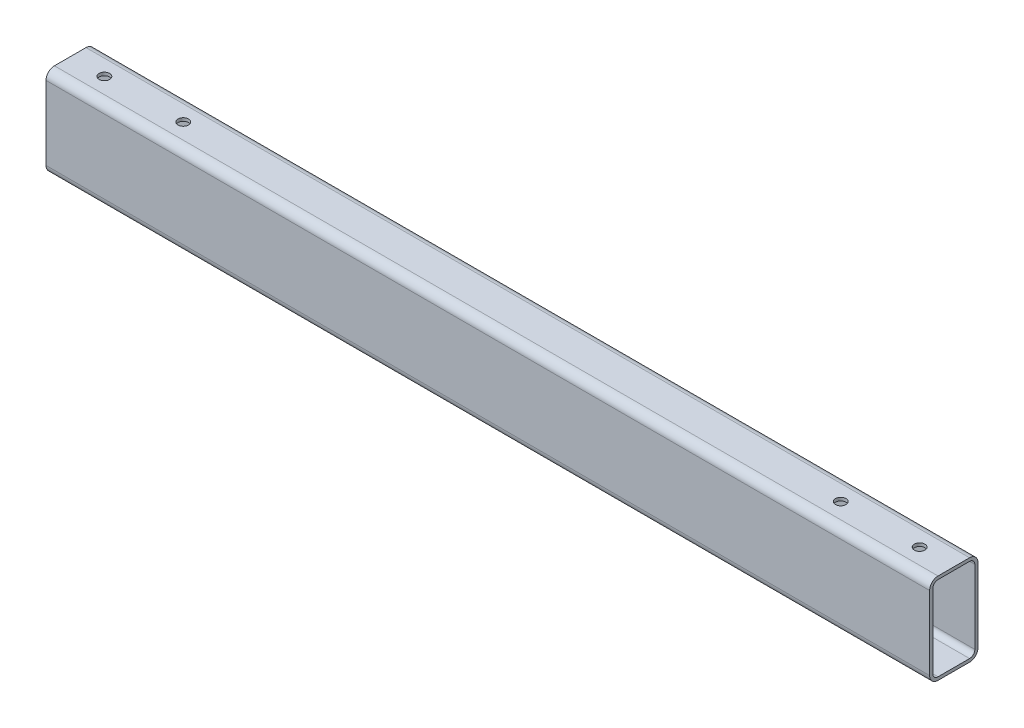
ISO-10303-21;
HEADER;
FILE_DESCRIPTION(('STEP AP214'),'2;1');
FILE_NAME('part.step','',(''),(''),'','','');
FILE_SCHEMA(('AUTOMOTIVE_DESIGN { 1 0 10303 214 1 1 1 1 }'));
ENDSEC;
DATA;
#1=APPLICATION_CONTEXT('core data for automotive mechanical design processes');
#2=APPLICATION_PROTOCOL_DEFINITION('international standard','automotive_design',2000,#1);
#3=PRODUCT_CONTEXT('',#1,'mechanical');
#4=PRODUCT('Part','Part','',(#3));
#5=PRODUCT_RELATED_PRODUCT_CATEGORY('part','',(#4));
#6=PRODUCT_DEFINITION_FORMATION('','',#4);
#7=PRODUCT_DEFINITION_CONTEXT('part definition',#1,'design');
#8=PRODUCT_DEFINITION('design','',#6,#7);
#9=PRODUCT_DEFINITION_SHAPE('','',#8);
#10=(LENGTH_UNIT() NAMED_UNIT(*) SI_UNIT(.MILLI.,.METRE.));
#11=(NAMED_UNIT(*) PLANE_ANGLE_UNIT() SI_UNIT($,.RADIAN.));
#12=(NAMED_UNIT(*) SI_UNIT($,.STERADIAN.) SOLID_ANGLE_UNIT());
#13=UNCERTAINTY_MEASURE_WITH_UNIT(LENGTH_MEASURE(1.E-05),#10,'distance_accuracy_value','');
#14=(GEOMETRIC_REPRESENTATION_CONTEXT(3) GLOBAL_UNCERTAINTY_ASSIGNED_CONTEXT((#13)) GLOBAL_UNIT_ASSIGNED_CONTEXT((#10,
#11,#12)) REPRESENTATION_CONTEXT('',''));
#15=CARTESIAN_POINT('',(0.,0.,0.));
#16=DIRECTION('',(0.,0.,1.));
#17=DIRECTION('',(1.,0.,0.));
#18=AXIS2_PLACEMENT_3D('',#15,#16,#17);
#19=CARTESIAN_POINT('',(-420.,-35.,15.));
#20=DIRECTION('',(1.,0.,0.));
#21=DIRECTION('',(0.,0.,-1.));
#22=AXIS2_PLACEMENT_3D('',#19,#20,#21);
#23=CYLINDRICAL_SURFACE('',#22,8.);
#24=DIRECTION('',(1.,0.,0.));
#25=VECTOR('',#24,1.);
#26=CARTESIAN_POINT('',(-420.,-43.,15.));
#27=LINE('',#26,#25);
#28=CARTESIAN_POINT('',(-420.,-43.,15.));
#29=VERTEX_POINT('',#28);
#30=CARTESIAN_POINT('',(420.,-43.,15.));
#31=VERTEX_POINT('',#30);
#32=EDGE_CURVE('E363',#29,#31,#27,.T.);
#33=ORIENTED_EDGE('',*,*,#32,.T.);
#34=CARTESIAN_POINT('',(420.,-35.,15.));
#35=DIRECTION('',(1.,0.,0.));
#36=DIRECTION('',(0.,0.,-1.));
#37=AXIS2_PLACEMENT_3D('',#34,#35,#36);
#38=CIRCLE('',#37,8.);
#39=CARTESIAN_POINT('',(420.,-35.,23.));
#40=VERTEX_POINT('',#39);
#41=EDGE_CURVE('E287',#40,#31,#38,.T.);
#42=ORIENTED_EDGE('',*,*,#41,.F.);
#43=DIRECTION('',(1.,0.,0.));
#44=VECTOR('',#43,1.);
#45=CARTESIAN_POINT('',(-420.,-35.,23.));
#46=LINE('',#45,#44);
#47=CARTESIAN_POINT('',(-420.,-35.,23.));
#48=VERTEX_POINT('',#47);
#49=EDGE_CURVE('E12',#48,#40,#46,.T.);
#50=ORIENTED_EDGE('',*,*,#49,.F.);
#51=CARTESIAN_POINT('',(-420.,-35.,15.));
#52=DIRECTION('',(1.,0.,0.));
#53=DIRECTION('',(0.,0.,-1.));
#54=AXIS2_PLACEMENT_3D('',#51,#52,#53);
#55=CIRCLE('',#54,8.);
#56=EDGE_CURVE('E330',#48,#29,#55,.T.);
#57=ORIENTED_EDGE('',*,*,#56,.T.);
#58=EDGE_LOOP('',(#33,#42,#50,#57));
#59=FACE_BOUND('',#58,.T.);
#60=ADVANCED_FACE('F129',(#59),#23,.T.);
#61=CARTESIAN_POINT('',(-420.,-35.,23.));
#62=DIRECTION('',(0.,0.,1.));
#63=DIRECTION('',(1.,0.,0.));
#64=AXIS2_PLACEMENT_3D('',#61,#62,#63);
#65=PLANE('',#64);
#66=ORIENTED_EDGE('',*,*,#49,.T.);
#67=DIRECTION('',(0.,-1.,0.));
#68=VECTOR('',#67,1.);
#69=CARTESIAN_POINT('',(420.,-35.,23.));
#70=LINE('',#69,#68);
#71=CARTESIAN_POINT('',(420.,35.,23.));
#72=VERTEX_POINT('',#71);
#73=EDGE_CURVE('E308',#72,#40,#70,.T.);
#74=ORIENTED_EDGE('',*,*,#73,.F.);
#75=DIRECTION('',(1.,0.,0.));
#76=VECTOR('',#75,1.);
#77=CARTESIAN_POINT('',(-420.,35.,23.));
#78=LINE('',#77,#76);
#79=CARTESIAN_POINT('',(-420.,35.,23.));
#80=VERTEX_POINT('',#79);
#81=EDGE_CURVE('E137',#80,#72,#78,.T.);
#82=ORIENTED_EDGE('',*,*,#81,.F.);
#83=DIRECTION('',(0.,-1.,0.));
#84=VECTOR('',#83,1.);
#85=CARTESIAN_POINT('',(-420.,-35.,23.));
#86=LINE('',#85,#84);
#87=EDGE_CURVE('E361',#80,#48,#86,.T.);
#88=ORIENTED_EDGE('',*,*,#87,.T.);
#89=EDGE_LOOP('',(#66,#74,#82,#88));
#90=FACE_BOUND('',#89,.T.);
#91=ADVANCED_FACE('F428',(#90),#65,.T.);
#92=CARTESIAN_POINT('',(-420.,35.,15.));
#93=DIRECTION('',(1.,0.,0.));
#94=DIRECTION('',(0.,0.,-1.));
#95=AXIS2_PLACEMENT_3D('',#92,#93,#94);
#96=CYLINDRICAL_SURFACE('',#95,8.);
#97=ORIENTED_EDGE('',*,*,#81,.T.);
#98=CARTESIAN_POINT('',(420.,35.,15.));
#99=DIRECTION('',(1.,0.,0.));
#100=DIRECTION('',(0.,0.,-1.));
#101=AXIS2_PLACEMENT_3D('',#98,#99,#100);
#102=CIRCLE('',#101,8.);
#103=CARTESIAN_POINT('',(420.,43.,15.));
#104=VERTEX_POINT('',#103);
#105=EDGE_CURVE('E305',#104,#72,#102,.T.);
#106=ORIENTED_EDGE('',*,*,#105,.F.);
#107=DIRECTION('',(1.,0.,0.));
#108=VECTOR('',#107,1.);
#109=CARTESIAN_POINT('',(-420.,43.,15.));
#110=LINE('',#109,#108);
#111=CARTESIAN_POINT('',(-420.,43.,15.));
#112=VERTEX_POINT('',#111);
#113=EDGE_CURVE('E366',#112,#104,#110,.T.);
#114=ORIENTED_EDGE('',*,*,#113,.F.);
#115=CARTESIAN_POINT('',(-420.,35.,15.));
#116=DIRECTION('',(1.,0.,0.));
#117=DIRECTION('',(0.,0.,-1.));
#118=AXIS2_PLACEMENT_3D('',#115,#116,#117);
#119=CIRCLE('',#118,8.);
#120=EDGE_CURVE('E358',#112,#80,#119,.T.);
#121=ORIENTED_EDGE('',*,*,#120,.T.);
#122=EDGE_LOOP('',(#97,#106,#114,#121));
#123=FACE_BOUND('',#122,.T.);
#124=ADVANCED_FACE('F432',(#123),#96,.T.);
#125=CARTESIAN_POINT('',(-420.,43.,15.));
#126=DIRECTION('',(0.,1.,0.));
#127=DIRECTION('',(0.,0.,1.));
#128=AXIS2_PLACEMENT_3D('',#125,#126,#127);
#129=PLANE('',#128);
#130=CARTESIAN_POINT('',(-387.5,43.,0.));
#131=DIRECTION('',(0.,1.,0.));
#132=DIRECTION('',(0.,0.,1.));
#133=AXIS2_PLACEMENT_3D('',#130,#131,#132);
#134=CIRCLE('',#133,4.99999999999999);
#135=CARTESIAN_POINT('',(-387.5,43.,4.99999999999999));
#136=VERTEX_POINT('',#135);
#137=EDGE_CURVE('E497',#136,#136,#134,.T.);
#138=ORIENTED_EDGE('',*,*,#137,.F.);
#139=EDGE_LOOP('',(#138));
#140=FACE_BOUND('',#139,.T.);
#141=CARTESIAN_POINT('',(312.5,43.,0.));
#142=DIRECTION('',(0.,1.,0.));
#143=DIRECTION('',(0.,0.,-1.));
#144=AXIS2_PLACEMENT_3D('',#141,#142,#143);
#145=CIRCLE('',#144,4.99999999999999);
#146=CARTESIAN_POINT('',(312.5,43.,-4.99999999999999));
#147=VERTEX_POINT('',#146);
#148=EDGE_CURVE('E510',#147,#147,#145,.T.);
#149=ORIENTED_EDGE('',*,*,#148,.F.);
#150=EDGE_LOOP('',(#149));
#151=FACE_BOUND('',#150,.T.);
#152=CARTESIAN_POINT('',(387.5,43.,0.));
#153=DIRECTION('',(0.,1.,0.));
#154=DIRECTION('',(0.,0.,-1.));
#155=AXIS2_PLACEMENT_3D('',#152,#153,#154);
#156=CIRCLE('',#155,4.99999999999999);
#157=CARTESIAN_POINT('',(387.5,43.,-4.99999999999999));
#158=VERTEX_POINT('',#157);
#159=EDGE_CURVE('E506',#158,#158,#156,.T.);
#160=ORIENTED_EDGE('',*,*,#159,.F.);
#161=EDGE_LOOP('',(#160));
#162=FACE_BOUND('',#161,.T.);
#163=CARTESIAN_POINT('',(-312.5,43.,0.));
#164=DIRECTION('',(0.,1.,0.));
#165=DIRECTION('',(0.,0.,1.));
#166=AXIS2_PLACEMENT_3D('',#163,#164,#165);
#167=CIRCLE('',#166,4.99999999999999);
#168=CARTESIAN_POINT('',(-312.5,43.,4.99999999999999));
#169=VERTEX_POINT('',#168);
#170=EDGE_CURVE('E498',#169,#169,#167,.T.);
#171=ORIENTED_EDGE('',*,*,#170,.F.);
#172=EDGE_LOOP('',(#171));
#173=FACE_BOUND('',#172,.T.);
#174=ORIENTED_EDGE('',*,*,#113,.T.);
#175=DIRECTION('',(0.,0.,1.));
#176=VECTOR('',#175,1.);
#177=CARTESIAN_POINT('',(420.,43.,15.));
#178=LINE('',#177,#176);
#179=CARTESIAN_POINT('',(420.,43.,-14.9999999999999));
#180=VERTEX_POINT('',#179);
#181=EDGE_CURVE('E302',#180,#104,#178,.T.);
#182=ORIENTED_EDGE('',*,*,#181,.F.);
#183=DIRECTION('',(1.,0.,0.));
#184=VECTOR('',#183,1.);
#185=CARTESIAN_POINT('',(-420.,43.,-14.9999999999999));
#186=LINE('',#185,#184);
#187=CARTESIAN_POINT('',(-420.,43.,-14.9999999999999));
#188=VERTEX_POINT('',#187);
#189=EDGE_CURVE('E368',#188,#180,#186,.T.);
#190=ORIENTED_EDGE('',*,*,#189,.F.);
#191=DIRECTION('',(0.,0.,1.));
#192=VECTOR('',#191,1.);
#193=CARTESIAN_POINT('',(-420.,43.,15.));
#194=LINE('',#193,#192);
#195=EDGE_CURVE('E355',#188,#112,#194,.T.);
#196=ORIENTED_EDGE('',*,*,#195,.T.);
#197=EDGE_LOOP('',(#174,#182,#190,#196));
#198=FACE_BOUND('',#197,.T.);
#199=ADVANCED_FACE('F460',(#140,#151,#162,#173,#198),#129,.T.);
#200=CARTESIAN_POINT('',(-420.,35.,-15.));
#201=DIRECTION('',(1.,0.,0.));
#202=DIRECTION('',(0.,0.,-1.));
#203=AXIS2_PLACEMENT_3D('',#200,#201,#202);
#204=CYLINDRICAL_SURFACE('',#203,8.);
#205=ORIENTED_EDGE('',*,*,#189,.T.);
#206=CARTESIAN_POINT('',(420.,35.,-15.));
#207=DIRECTION('',(1.,0.,0.));
#208=DIRECTION('',(0.,0.,-1.));
#209=AXIS2_PLACEMENT_3D('',#206,#207,#208);
#210=CIRCLE('',#209,8.);
#211=CARTESIAN_POINT('',(420.,35.,-23.));
#212=VERTEX_POINT('',#211);
#213=EDGE_CURVE('E299',#212,#180,#210,.T.);
#214=ORIENTED_EDGE('',*,*,#213,.F.);
#215=DIRECTION('',(1.,0.,0.));
#216=VECTOR('',#215,1.);
#217=CARTESIAN_POINT('',(-420.,35.,-23.));
#218=LINE('',#217,#216);
#219=CARTESIAN_POINT('',(-420.,35.,-23.));
#220=VERTEX_POINT('',#219);
#221=EDGE_CURVE('E370',#220,#212,#218,.T.);
#222=ORIENTED_EDGE('',*,*,#221,.F.);
#223=CARTESIAN_POINT('',(-420.,35.,-15.));
#224=DIRECTION('',(1.,0.,0.));
#225=DIRECTION('',(0.,0.,-1.));
#226=AXIS2_PLACEMENT_3D('',#223,#224,#225);
#227=CIRCLE('',#226,8.);
#228=EDGE_CURVE('E352',#220,#188,#227,.T.);
#229=ORIENTED_EDGE('',*,*,#228,.T.);
#230=EDGE_LOOP('',(#205,#214,#222,#229));
#231=FACE_BOUND('',#230,.T.);
#232=ADVANCED_FACE('F458',(#231),#204,.T.);
#233=CARTESIAN_POINT('',(-420.,-35.,-23.));
#234=DIRECTION('',(0.,0.,-1.));
#235=DIRECTION('',(-1.,0.,0.));
#236=AXIS2_PLACEMENT_3D('',#233,#234,#235);
#237=PLANE('',#236);
#238=ORIENTED_EDGE('',*,*,#221,.T.);
#239=DIRECTION('',(0.,1.,0.));
#240=VECTOR('',#239,1.);
#241=CARTESIAN_POINT('',(420.,-35.,-23.));
#242=LINE('',#241,#240);
#243=CARTESIAN_POINT('',(420.,-34.9999999999999,-23.));
#244=VERTEX_POINT('',#243);
#245=EDGE_CURVE('E296',#244,#212,#242,.T.);
#246=ORIENTED_EDGE('',*,*,#245,.F.);
#247=DIRECTION('',(1.,0.,0.));
#248=VECTOR('',#247,1.);
#249=CARTESIAN_POINT('',(-420.,-34.9999999999999,-23.));
#250=LINE('',#249,#248);
#251=CARTESIAN_POINT('',(-420.,-34.9999999999999,-23.));
#252=VERTEX_POINT('',#251);
#253=EDGE_CURVE('E372',#252,#244,#250,.T.);
#254=ORIENTED_EDGE('',*,*,#253,.F.);
#255=DIRECTION('',(0.,1.,0.));
#256=VECTOR('',#255,1.);
#257=CARTESIAN_POINT('',(-420.,-35.,-23.));
#258=LINE('',#257,#256);
#259=EDGE_CURVE('E349',#252,#220,#258,.T.);
#260=ORIENTED_EDGE('',*,*,#259,.T.);
#261=EDGE_LOOP('',(#238,#246,#254,#260));
#262=FACE_BOUND('',#261,.T.);
#263=ADVANCED_FACE('F456',(#262),#237,.T.);
#264=CARTESIAN_POINT('',(-420.,-35.,-15.));
#265=DIRECTION('',(1.,0.,0.));
#266=DIRECTION('',(0.,0.,-1.));
#267=AXIS2_PLACEMENT_3D('',#264,#265,#266);
#268=CYLINDRICAL_SURFACE('',#267,8.);
#269=ORIENTED_EDGE('',*,*,#253,.T.);
#270=CARTESIAN_POINT('',(420.,-35.,-15.));
#271=DIRECTION('',(1.,0.,0.));
#272=DIRECTION('',(0.,0.,-1.));
#273=AXIS2_PLACEMENT_3D('',#270,#271,#272);
#274=CIRCLE('',#273,8.);
#275=CARTESIAN_POINT('',(420.,-43.,-15.));
#276=VERTEX_POINT('',#275);
#277=EDGE_CURVE('E293',#276,#244,#274,.T.);
#278=ORIENTED_EDGE('',*,*,#277,.F.);
#279=DIRECTION('',(1.,0.,0.));
#280=VECTOR('',#279,1.);
#281=CARTESIAN_POINT('',(-420.,-43.,-15.));
#282=LINE('',#281,#280);
#283=CARTESIAN_POINT('',(-420.,-43.,-15.));
#284=VERTEX_POINT('',#283);
#285=EDGE_CURVE('E374',#284,#276,#282,.T.);
#286=ORIENTED_EDGE('',*,*,#285,.F.);
#287=CARTESIAN_POINT('',(-420.,-35.,-15.));
#288=DIRECTION('',(1.,0.,0.));
#289=DIRECTION('',(0.,0.,-1.));
#290=AXIS2_PLACEMENT_3D('',#287,#288,#289);
#291=CIRCLE('',#290,8.);
#292=EDGE_CURVE('E346',#284,#252,#291,.T.);
#293=ORIENTED_EDGE('',*,*,#292,.T.);
#294=EDGE_LOOP('',(#269,#278,#286,#293));
#295=FACE_BOUND('',#294,.T.);
#296=ADVANCED_FACE('F452',(#295),#268,.T.);
#297=CARTESIAN_POINT('',(-420.,-43.,15.));
#298=DIRECTION('',(0.,-1.,0.));
#299=DIRECTION('',(0.,0.,-1.));
#300=AXIS2_PLACEMENT_3D('',#297,#298,#299);
#301=PLANE('',#300);
#302=CARTESIAN_POINT('',(-387.5,-43.,0.));
#303=DIRECTION('',(0.,1.,0.));
#304=DIRECTION('',(0.,0.,1.));
#305=AXIS2_PLACEMENT_3D('',#302,#303,#304);
#306=CIRCLE('',#305,4.99999999999999);
#307=CARTESIAN_POINT('',(-387.5,-43.,4.99999999999999));
#308=VERTEX_POINT('',#307);
#309=EDGE_CURVE('E381',#308,#308,#306,.T.);
#310=ORIENTED_EDGE('',*,*,#309,.T.);
#311=EDGE_LOOP('',(#310));
#312=FACE_BOUND('',#311,.T.);
#313=CARTESIAN_POINT('',(312.5,-43.,0.));
#314=DIRECTION('',(0.,1.,0.));
#315=DIRECTION('',(0.,0.,-1.));
#316=AXIS2_PLACEMENT_3D('',#313,#314,#315);
#317=CIRCLE('',#316,4.99999999999999);
#318=CARTESIAN_POINT('',(312.5,-43.,-4.99999999999999));
#319=VERTEX_POINT('',#318);
#320=EDGE_CURVE('E488',#319,#319,#317,.T.);
#321=ORIENTED_EDGE('',*,*,#320,.T.);
#322=EDGE_LOOP('',(#321));
#323=FACE_BOUND('',#322,.T.);
#324=CARTESIAN_POINT('',(387.5,-43.,0.));
#325=DIRECTION('',(0.,1.,0.));
#326=DIRECTION('',(0.,0.,-1.));
#327=AXIS2_PLACEMENT_3D('',#324,#325,#326);
#328=CIRCLE('',#327,4.99999999999999);
#329=CARTESIAN_POINT('',(387.5,-43.,-4.99999999999999));
#330=VERTEX_POINT('',#329);
#331=EDGE_CURVE('E492',#330,#330,#328,.T.);
#332=ORIENTED_EDGE('',*,*,#331,.T.);
#333=EDGE_LOOP('',(#332));
#334=FACE_BOUND('',#333,.T.);
#335=CARTESIAN_POINT('',(-312.5,-43.,0.));
#336=DIRECTION('',(0.,1.,0.));
#337=DIRECTION('',(0.,0.,1.));
#338=AXIS2_PLACEMENT_3D('',#335,#336,#337);
#339=CIRCLE('',#338,4.99999999999999);
#340=CARTESIAN_POINT('',(-312.5,-43.,4.99999999999999));
#341=VERTEX_POINT('',#340);
#342=EDGE_CURVE('E495',#341,#341,#339,.T.);
#343=ORIENTED_EDGE('',*,*,#342,.T.);
#344=EDGE_LOOP('',(#343));
#345=FACE_BOUND('',#344,.T.);
#346=ORIENTED_EDGE('',*,*,#285,.T.);
#347=DIRECTION('',(0.,0.,-1.));
#348=VECTOR('',#347,1.);
#349=CARTESIAN_POINT('',(420.,-43.,15.));
#350=LINE('',#349,#348);
#351=EDGE_CURVE('E290',#31,#276,#350,.T.);
#352=ORIENTED_EDGE('',*,*,#351,.F.);
#353=ORIENTED_EDGE('',*,*,#32,.F.);
#354=DIRECTION('',(0.,0.,-1.));
#355=VECTOR('',#354,1.);
#356=CARTESIAN_POINT('',(-420.,-43.,15.));
#357=LINE('',#356,#355);
#358=EDGE_CURVE('E343',#29,#284,#357,.T.);
#359=ORIENTED_EDGE('',*,*,#358,.T.);
#360=EDGE_LOOP('',(#346,#352,#353,#359));
#361=FACE_BOUND('',#360,.T.);
#362=ADVANCED_FACE('F438',(#312,#323,#334,#345,#361),#301,.T.);
#363=CARTESIAN_POINT('',(-420.,-35.,15.));
#364=DIRECTION('',(1.,0.,0.));
#365=DIRECTION('',(0.,0.,-1.));
#366=AXIS2_PLACEMENT_3D('',#363,#364,#365);
#367=PLANE('',#366);
#368=DIRECTION('',(0.,-1.,0.));
#369=VECTOR('',#368,1.);
#370=CARTESIAN_POINT('',(-420.,-35.,20.));
#371=LINE('',#370,#369);
#372=CARTESIAN_POINT('',(-420.,35.,20.));
#373=VERTEX_POINT('',#372);
#374=CARTESIAN_POINT('',(-420.,-35.,20.));
#375=VERTEX_POINT('',#374);
#376=EDGE_CURVE('E254',#373,#375,#371,.T.);
#377=ORIENTED_EDGE('',*,*,#376,.T.);
#378=CARTESIAN_POINT('',(-420.,-35.,15.));
#379=DIRECTION('',(1.,0.,0.));
#380=DIRECTION('',(0.,0.,-1.));
#381=AXIS2_PLACEMENT_3D('',#378,#379,#380);
#382=CIRCLE('',#381,5.);
#383=CARTESIAN_POINT('',(-420.,-40.,15.));
#384=VERTEX_POINT('',#383);
#385=EDGE_CURVE('E311',#375,#384,#382,.T.);
#386=ORIENTED_EDGE('',*,*,#385,.T.);
#387=DIRECTION('',(0.,0.,-1.));
#388=VECTOR('',#387,1.);
#389=CARTESIAN_POINT('',(-420.,-40.,15.));
#390=LINE('',#389,#388);
#391=CARTESIAN_POINT('',(-420.,-40.,-15.));
#392=VERTEX_POINT('',#391);
#393=EDGE_CURVE('E249',#384,#392,#390,.T.);
#394=ORIENTED_EDGE('',*,*,#393,.T.);
#395=CARTESIAN_POINT('',(-420.,-35.,-15.));
#396=DIRECTION('',(1.,0.,0.));
#397=DIRECTION('',(0.,0.,-1.));
#398=AXIS2_PLACEMENT_3D('',#395,#396,#397);
#399=CIRCLE('',#398,5.);
#400=CARTESIAN_POINT('',(-420.,-35.,-20.));
#401=VERTEX_POINT('',#400);
#402=EDGE_CURVE('E145',#392,#401,#399,.T.);
#403=ORIENTED_EDGE('',*,*,#402,.T.);
#404=DIRECTION('',(0.,1.,0.));
#405=VECTOR('',#404,1.);
#406=CARTESIAN_POINT('',(-420.,-35.,-20.));
#407=LINE('',#406,#405);
#408=CARTESIAN_POINT('',(-420.,35.,-20.));
#409=VERTEX_POINT('',#408);
#410=EDGE_CURVE('E315',#401,#409,#407,.T.);
#411=ORIENTED_EDGE('',*,*,#410,.T.);
#412=CARTESIAN_POINT('',(-420.,35.,-15.));
#413=DIRECTION('',(1.,0.,0.));
#414=DIRECTION('',(0.,0.,-1.));
#415=AXIS2_PLACEMENT_3D('',#412,#413,#414);
#416=CIRCLE('',#415,5.);
#417=CARTESIAN_POINT('',(-420.,40.,-15.));
#418=VERTEX_POINT('',#417);
#419=EDGE_CURVE('E318',#409,#418,#416,.T.);
#420=ORIENTED_EDGE('',*,*,#419,.T.);
#421=DIRECTION('',(0.,0.,1.));
#422=VECTOR('',#421,1.);
#423=CARTESIAN_POINT('',(-420.,40.,15.));
#424=LINE('',#423,#422);
#425=CARTESIAN_POINT('',(-420.,40.,15.));
#426=VERTEX_POINT('',#425);
#427=EDGE_CURVE('E321',#418,#426,#424,.T.);
#428=ORIENTED_EDGE('',*,*,#427,.T.);
#429=CARTESIAN_POINT('',(-420.,35.,15.));
#430=DIRECTION('',(1.,0.,0.));
#431=DIRECTION('',(0.,0.,-1.));
#432=AXIS2_PLACEMENT_3D('',#429,#430,#431);
#433=CIRCLE('',#432,5.);
#434=EDGE_CURVE('E324',#426,#373,#433,.T.);
#435=ORIENTED_EDGE('',*,*,#434,.T.);
#436=EDGE_LOOP('',(#377,#386,#394,#403,#411,#420,#428,#435));
#437=FACE_BOUND('',#436,.T.);
#438=ORIENTED_EDGE('',*,*,#56,.F.);
#439=ORIENTED_EDGE('',*,*,#87,.F.);
#440=ORIENTED_EDGE('',*,*,#120,.F.);
#441=ORIENTED_EDGE('',*,*,#195,.F.);
#442=ORIENTED_EDGE('',*,*,#228,.F.);
#443=ORIENTED_EDGE('',*,*,#259,.F.);
#444=ORIENTED_EDGE('',*,*,#292,.F.);
#445=ORIENTED_EDGE('',*,*,#358,.F.);
#446=EDGE_LOOP('',(#438,#439,#440,#441,#442,#443,#444,#445));
#447=FACE_BOUND('',#446,.T.);
#448=ADVANCED_FACE('F446',(#437,#447),#367,.F.);
#449=CARTESIAN_POINT('',(-420.,-35.,15.));
#450=DIRECTION('',(1.,0.,0.));
#451=DIRECTION('',(0.,0.,-1.));
#452=AXIS2_PLACEMENT_3D('',#449,#450,#451);
#453=CYLINDRICAL_SURFACE('',#452,5.);
#454=DIRECTION('',(1.,0.,0.));
#455=VECTOR('',#454,1.);
#456=CARTESIAN_POINT('',(-420.,-35.,20.));
#457=LINE('',#456,#455);
#458=CARTESIAN_POINT('',(420.,-35.,20.));
#459=VERTEX_POINT('',#458);
#460=EDGE_CURVE('E259',#375,#459,#457,.T.);
#461=ORIENTED_EDGE('',*,*,#460,.T.);
#462=CARTESIAN_POINT('',(420.,-35.,15.));
#463=DIRECTION('',(1.,0.,0.));
#464=DIRECTION('',(0.,0.,-1.));
#465=AXIS2_PLACEMENT_3D('',#462,#463,#464);
#466=CIRCLE('',#465,5.);
#467=CARTESIAN_POINT('',(420.,-40.,15.));
#468=VERTEX_POINT('',#467);
#469=EDGE_CURVE('E257',#459,#468,#466,.T.);
#470=ORIENTED_EDGE('',*,*,#469,.T.);
#471=DIRECTION('',(1.,0.,0.));
#472=VECTOR('',#471,1.);
#473=CARTESIAN_POINT('',(-420.,-40.,15.));
#474=LINE('',#473,#472);
#475=EDGE_CURVE('E242',#384,#468,#474,.T.);
#476=ORIENTED_EDGE('',*,*,#475,.F.);
#477=ORIENTED_EDGE('',*,*,#385,.F.);
#478=EDGE_LOOP('',(#461,#470,#476,#477));
#479=FACE_BOUND('',#478,.T.);
#480=ADVANCED_FACE('F258',(#479),#453,.F.);
#481=CARTESIAN_POINT('',(-420.,-35.,20.));
#482=DIRECTION('',(0.,0.,1.));
#483=DIRECTION('',(1.,0.,0.));
#484=AXIS2_PLACEMENT_3D('',#481,#482,#483);
#485=PLANE('',#484);
#486=DIRECTION('',(1.,0.,0.));
#487=VECTOR('',#486,1.);
#488=CARTESIAN_POINT('',(-420.,35.,20.));
#489=LINE('',#488,#487);
#490=CARTESIAN_POINT('',(420.,35.,20.));
#491=VERTEX_POINT('',#490);
#492=EDGE_CURVE('E331',#373,#491,#489,.T.);
#493=ORIENTED_EDGE('',*,*,#492,.T.);
#494=DIRECTION('',(0.,-1.,0.));
#495=VECTOR('',#494,1.);
#496=CARTESIAN_POINT('',(420.,-35.,20.));
#497=LINE('',#496,#495);
#498=EDGE_CURVE('E285',#491,#459,#497,.T.);
#499=ORIENTED_EDGE('',*,*,#498,.T.);
#500=ORIENTED_EDGE('',*,*,#460,.F.);
#501=ORIENTED_EDGE('',*,*,#376,.F.);
#502=EDGE_LOOP('',(#493,#499,#500,#501));
#503=FACE_BOUND('',#502,.T.);
#504=ADVANCED_FACE('F545',(#503),#485,.F.);
#505=CARTESIAN_POINT('',(-420.,35.,15.));
#506=DIRECTION('',(1.,0.,0.));
#507=DIRECTION('',(0.,0.,-1.));
#508=AXIS2_PLACEMENT_3D('',#505,#506,#507);
#509=CYLINDRICAL_SURFACE('',#508,5.);
#510=DIRECTION('',(1.,0.,0.));
#511=VECTOR('',#510,1.);
#512=CARTESIAN_POINT('',(-420.,40.,15.));
#513=LINE('',#512,#511);
#514=CARTESIAN_POINT('',(420.,40.,15.));
#515=VERTEX_POINT('',#514);
#516=EDGE_CURVE('E333',#426,#515,#513,.T.);
#517=ORIENTED_EDGE('',*,*,#516,.T.);
#518=CARTESIAN_POINT('',(420.,35.,15.));
#519=DIRECTION('',(1.,0.,0.));
#520=DIRECTION('',(0.,0.,-1.));
#521=AXIS2_PLACEMENT_3D('',#518,#519,#520);
#522=CIRCLE('',#521,5.);
#523=EDGE_CURVE('E282',#515,#491,#522,.T.);
#524=ORIENTED_EDGE('',*,*,#523,.T.);
#525=ORIENTED_EDGE('',*,*,#492,.F.);
#526=ORIENTED_EDGE('',*,*,#434,.F.);
#527=EDGE_LOOP('',(#517,#524,#525,#526));
#528=FACE_BOUND('',#527,.T.);
#529=ADVANCED_FACE('F529',(#528),#509,.F.);
#530=CARTESIAN_POINT('',(-420.,40.,15.));
#531=DIRECTION('',(0.,1.,0.));
#532=DIRECTION('',(0.,0.,1.));
#533=AXIS2_PLACEMENT_3D('',#530,#531,#532);
#534=PLANE('',#533);
#535=CARTESIAN_POINT('',(-387.5,40.,0.));
#536=DIRECTION('',(0.,1.,0.));
#537=DIRECTION('',(0.,0.,1.));
#538=AXIS2_PLACEMENT_3D('',#535,#536,#537);
#539=CIRCLE('',#538,4.99999999999999);
#540=CARTESIAN_POINT('',(-387.5,40.,4.99999999999999));
#541=VERTEX_POINT('',#540);
#542=EDGE_CURVE('E263',#541,#541,#539,.T.);
#543=ORIENTED_EDGE('',*,*,#542,.T.);
#544=EDGE_LOOP('',(#543));
#545=FACE_BOUND('',#544,.T.);
#546=CARTESIAN_POINT('',(312.5,40.,0.));
#547=DIRECTION('',(0.,1.,0.));
#548=DIRECTION('',(0.,0.,1.));
#549=AXIS2_PLACEMENT_3D('',#546,#547,#548);
#550=CIRCLE('',#549,4.99999999999999);
#551=CARTESIAN_POINT('',(312.5,40.,4.99999999999999));
#552=VERTEX_POINT('',#551);
#553=EDGE_CURVE('E387',#552,#552,#550,.T.);
#554=ORIENTED_EDGE('',*,*,#553,.T.);
#555=EDGE_LOOP('',(#554));
#556=FACE_BOUND('',#555,.T.);
#557=CARTESIAN_POINT('',(387.5,40.,0.));
#558=DIRECTION('',(0.,1.,0.));
#559=DIRECTION('',(0.,0.,1.));
#560=AXIS2_PLACEMENT_3D('',#557,#558,#559);
#561=CIRCLE('',#560,4.99999999999999);
#562=CARTESIAN_POINT('',(387.5,40.,4.99999999999999));
#563=VERTEX_POINT('',#562);
#564=EDGE_CURVE('E384',#563,#563,#561,.T.);
#565=ORIENTED_EDGE('',*,*,#564,.T.);
#566=EDGE_LOOP('',(#565));
#567=FACE_BOUND('',#566,.T.);
#568=CARTESIAN_POINT('',(-312.5,40.,0.));
#569=DIRECTION('',(0.,1.,0.));
#570=DIRECTION('',(0.,0.,1.));
#571=AXIS2_PLACEMENT_3D('',#568,#569,#570);
#572=CIRCLE('',#571,4.99999999999999);
#573=CARTESIAN_POINT('',(-312.5,40.,4.99999999999999));
#574=VERTEX_POINT('',#573);
#575=EDGE_CURVE('E380',#574,#574,#572,.T.);
#576=ORIENTED_EDGE('',*,*,#575,.T.);
#577=EDGE_LOOP('',(#576));
#578=FACE_BOUND('',#577,.T.);
#579=DIRECTION('',(1.,0.,0.));
#580=VECTOR('',#579,1.);
#581=CARTESIAN_POINT('',(-420.,40.,-15.));
#582=LINE('',#581,#580);
#583=CARTESIAN_POINT('',(420.,40.,-15.));
#584=VERTEX_POINT('',#583);
#585=EDGE_CURVE('E335',#418,#584,#582,.T.);
#586=ORIENTED_EDGE('',*,*,#585,.T.);
#587=DIRECTION('',(0.,0.,1.));
#588=VECTOR('',#587,1.);
#589=CARTESIAN_POINT('',(420.,40.,15.));
#590=LINE('',#589,#588);
#591=EDGE_CURVE('E279',#584,#515,#590,.T.);
#592=ORIENTED_EDGE('',*,*,#591,.T.);
#593=ORIENTED_EDGE('',*,*,#516,.F.);
#594=ORIENTED_EDGE('',*,*,#427,.F.);
#595=EDGE_LOOP('',(#586,#592,#593,#594));
#596=FACE_BOUND('',#595,.T.);
#597=ADVANCED_FACE('F525',(#545,#556,#567,#578,#596),#534,.F.);
#598=CARTESIAN_POINT('',(-420.,35.,-15.));
#599=DIRECTION('',(1.,0.,0.));
#600=DIRECTION('',(0.,0.,-1.));
#601=AXIS2_PLACEMENT_3D('',#598,#599,#600);
#602=CYLINDRICAL_SURFACE('',#601,5.);
#603=DIRECTION('',(1.,0.,0.));
#604=VECTOR('',#603,1.);
#605=CARTESIAN_POINT('',(-420.,35.,-20.));
#606=LINE('',#605,#604);
#607=CARTESIAN_POINT('',(420.,35.,-20.));
#608=VERTEX_POINT('',#607);
#609=EDGE_CURVE('E337',#409,#608,#606,.T.);
#610=ORIENTED_EDGE('',*,*,#609,.T.);
#611=CARTESIAN_POINT('',(420.,35.,-15.));
#612=DIRECTION('',(1.,0.,0.));
#613=DIRECTION('',(0.,0.,-1.));
#614=AXIS2_PLACEMENT_3D('',#611,#612,#613);
#615=CIRCLE('',#614,5.);
#616=EDGE_CURVE('E276',#608,#584,#615,.T.);
#617=ORIENTED_EDGE('',*,*,#616,.T.);
#618=ORIENTED_EDGE('',*,*,#585,.F.);
#619=ORIENTED_EDGE('',*,*,#419,.F.);
#620=EDGE_LOOP('',(#610,#617,#618,#619));
#621=FACE_BOUND('',#620,.T.);
#622=ADVANCED_FACE('F528',(#621),#602,.F.);
#623=CARTESIAN_POINT('',(-420.,-35.,-20.));
#624=DIRECTION('',(0.,0.,-1.));
#625=DIRECTION('',(-1.,0.,0.));
#626=AXIS2_PLACEMENT_3D('',#623,#624,#625);
#627=PLANE('',#626);
#628=DIRECTION('',(1.,0.,0.));
#629=VECTOR('',#628,1.);
#630=CARTESIAN_POINT('',(-420.,-35.,-20.));
#631=LINE('',#630,#629);
#632=CARTESIAN_POINT('',(420.,-35.,-20.));
#633=VERTEX_POINT('',#632);
#634=EDGE_CURVE('E339',#401,#633,#631,.T.);
#635=ORIENTED_EDGE('',*,*,#634,.T.);
#636=DIRECTION('',(0.,1.,0.));
#637=VECTOR('',#636,1.);
#638=CARTESIAN_POINT('',(420.,-35.,-20.));
#639=LINE('',#638,#637);
#640=EDGE_CURVE('E270',#633,#608,#639,.T.);
#641=ORIENTED_EDGE('',*,*,#640,.T.);
#642=ORIENTED_EDGE('',*,*,#609,.F.);
#643=ORIENTED_EDGE('',*,*,#410,.F.);
#644=EDGE_LOOP('',(#635,#641,#642,#643));
#645=FACE_BOUND('',#644,.T.);
#646=ADVANCED_FACE('F542',(#645),#627,.F.);
#647=CARTESIAN_POINT('',(-420.,-35.,-15.));
#648=DIRECTION('',(1.,0.,0.));
#649=DIRECTION('',(0.,0.,-1.));
#650=AXIS2_PLACEMENT_3D('',#647,#648,#649);
#651=CYLINDRICAL_SURFACE('',#650,5.);
#652=DIRECTION('',(1.,0.,0.));
#653=VECTOR('',#652,1.);
#654=CARTESIAN_POINT('',(-420.,-40.,-15.));
#655=LINE('',#654,#653);
#656=CARTESIAN_POINT('',(420.,-40.,-15.));
#657=VERTEX_POINT('',#656);
#658=EDGE_CURVE('E253',#392,#657,#655,.T.);
#659=ORIENTED_EDGE('',*,*,#658,.T.);
#660=CARTESIAN_POINT('',(420.,-35.,-15.));
#661=DIRECTION('',(1.,0.,0.));
#662=DIRECTION('',(0.,0.,-1.));
#663=AXIS2_PLACEMENT_3D('',#660,#661,#662);
#664=CIRCLE('',#663,5.);
#665=EDGE_CURVE('E268',#657,#633,#664,.T.);
#666=ORIENTED_EDGE('',*,*,#665,.T.);
#667=ORIENTED_EDGE('',*,*,#634,.F.);
#668=ORIENTED_EDGE('',*,*,#402,.F.);
#669=EDGE_LOOP('',(#659,#666,#667,#668));
#670=FACE_BOUND('',#669,.T.);
#671=ADVANCED_FACE('F543',(#670),#651,.F.);
#672=CARTESIAN_POINT('',(-420.,-40.,15.));
#673=DIRECTION('',(0.,-1.,0.));
#674=DIRECTION('',(0.,0.,-1.));
#675=AXIS2_PLACEMENT_3D('',#672,#673,#674);
#676=PLANE('',#675);
#677=CARTESIAN_POINT('',(-387.5,-40.,0.));
#678=DIRECTION('',(0.,-1.,0.));
#679=DIRECTION('',(0.,0.,-1.));
#680=AXIS2_PLACEMENT_3D('',#677,#678,#679);
#681=CIRCLE('',#680,4.99999999999999);
#682=CARTESIAN_POINT('',(-387.5,-40.,-4.99999999999999));
#683=VERTEX_POINT('',#682);
#684=EDGE_CURVE('E132',#683,#683,#681,.T.);
#685=ORIENTED_EDGE('',*,*,#684,.T.);
#686=EDGE_LOOP('',(#685));
#687=FACE_BOUND('',#686,.T.);
#688=CARTESIAN_POINT('',(312.5,-40.,0.));
#689=DIRECTION('',(0.,-1.,0.));
#690=DIRECTION('',(0.,0.,-1.));
#691=AXIS2_PLACEMENT_3D('',#688,#689,#690);
#692=CIRCLE('',#691,4.99999999999999);
#693=CARTESIAN_POINT('',(312.5,-40.,-4.99999999999999));
#694=VERTEX_POINT('',#693);
#695=EDGE_CURVE('E385',#694,#694,#692,.T.);
#696=ORIENTED_EDGE('',*,*,#695,.T.);
#697=EDGE_LOOP('',(#696));
#698=FACE_BOUND('',#697,.T.);
#699=CARTESIAN_POINT('',(387.5,-40.,0.));
#700=DIRECTION('',(0.,-1.,0.));
#701=DIRECTION('',(0.,0.,-1.));
#702=AXIS2_PLACEMENT_3D('',#699,#700,#701);
#703=CIRCLE('',#702,4.99999999999999);
#704=CARTESIAN_POINT('',(387.5,-40.,-4.99999999999999));
#705=VERTEX_POINT('',#704);
#706=EDGE_CURVE('E382',#705,#705,#703,.T.);
#707=ORIENTED_EDGE('',*,*,#706,.T.);
#708=EDGE_LOOP('',(#707));
#709=FACE_BOUND('',#708,.T.);
#710=CARTESIAN_POINT('',(-312.5,-40.,0.));
#711=DIRECTION('',(0.,-1.,0.));
#712=DIRECTION('',(0.,0.,-1.));
#713=AXIS2_PLACEMENT_3D('',#710,#711,#712);
#714=CIRCLE('',#713,4.99999999999999);
#715=CARTESIAN_POINT('',(-312.5,-40.,-4.99999999999999));
#716=VERTEX_POINT('',#715);
#717=EDGE_CURVE('E377',#716,#716,#714,.T.);
#718=ORIENTED_EDGE('',*,*,#717,.T.);
#719=EDGE_LOOP('',(#718));
#720=FACE_BOUND('',#719,.T.);
#721=ORIENTED_EDGE('',*,*,#475,.T.);
#722=DIRECTION('',(0.,0.,-1.));
#723=VECTOR('',#722,1.);
#724=CARTESIAN_POINT('',(420.,-40.,15.));
#725=LINE('',#724,#723);
#726=EDGE_CURVE('E246',#468,#657,#725,.T.);
#727=ORIENTED_EDGE('',*,*,#726,.T.);
#728=ORIENTED_EDGE('',*,*,#658,.F.);
#729=ORIENTED_EDGE('',*,*,#393,.F.);
#730=EDGE_LOOP('',(#721,#727,#728,#729));
#731=FACE_BOUND('',#730,.T.);
#732=ADVANCED_FACE('F244',(#687,#698,#709,#720,#731),#676,.F.);
#733=CARTESIAN_POINT('',(420.,-35.,15.));
#734=DIRECTION('',(1.,0.,0.));
#735=DIRECTION('',(0.,0.,-1.));
#736=AXIS2_PLACEMENT_3D('',#733,#734,#735);
#737=PLANE('',#736);
#738=ORIENTED_EDGE('',*,*,#41,.T.);
#739=ORIENTED_EDGE('',*,*,#351,.T.);
#740=ORIENTED_EDGE('',*,*,#277,.T.);
#741=ORIENTED_EDGE('',*,*,#245,.T.);
#742=ORIENTED_EDGE('',*,*,#213,.T.);
#743=ORIENTED_EDGE('',*,*,#181,.T.);
#744=ORIENTED_EDGE('',*,*,#105,.T.);
#745=ORIENTED_EDGE('',*,*,#73,.T.);
#746=EDGE_LOOP('',(#738,#739,#740,#741,#742,#743,#744,#745));
#747=FACE_BOUND('',#746,.T.);
#748=ORIENTED_EDGE('',*,*,#726,.F.);
#749=ORIENTED_EDGE('',*,*,#469,.F.);
#750=ORIENTED_EDGE('',*,*,#498,.F.);
#751=ORIENTED_EDGE('',*,*,#523,.F.);
#752=ORIENTED_EDGE('',*,*,#591,.F.);
#753=ORIENTED_EDGE('',*,*,#616,.F.);
#754=ORIENTED_EDGE('',*,*,#640,.F.);
#755=ORIENTED_EDGE('',*,*,#665,.F.);
#756=EDGE_LOOP('',(#748,#749,#750,#751,#752,#753,#754,#755));
#757=FACE_BOUND('',#756,.T.);
#758=ADVANCED_FACE('F265',(#747,#757),#737,.T.);
#759=CARTESIAN_POINT('',(-312.5,-43.,0.));
#760=DIRECTION('',(0.,1.,0.));
#761=DIRECTION('',(0.,0.,1.));
#762=AXIS2_PLACEMENT_3D('',#759,#760,#761);
#763=CYLINDRICAL_SURFACE('',#762,4.99999999999999);
#764=ORIENTED_EDGE('',*,*,#342,.F.);
#765=EDGE_LOOP('',(#764));
#766=FACE_BOUND('',#765,.T.);
#767=ORIENTED_EDGE('',*,*,#717,.F.);
#768=EDGE_LOOP('',(#767));
#769=FACE_BOUND('',#768,.T.);
#770=ADVANCED_FACE('F419',(#766,#769),#763,.F.);
#771=CARTESIAN_POINT('',(387.5,-43.,0.));
#772=DIRECTION('',(0.,1.,0.));
#773=DIRECTION('',(0.,0.,1.));
#774=AXIS2_PLACEMENT_3D('',#771,#772,#773);
#775=CYLINDRICAL_SURFACE('',#774,4.99999999999999);
#776=ORIENTED_EDGE('',*,*,#331,.F.);
#777=EDGE_LOOP('',(#776));
#778=FACE_BOUND('',#777,.T.);
#779=ORIENTED_EDGE('',*,*,#706,.F.);
#780=EDGE_LOOP('',(#779));
#781=FACE_BOUND('',#780,.T.);
#782=ADVANCED_FACE('F420',(#778,#781),#775,.F.);
#783=CARTESIAN_POINT('',(312.5,-43.,0.));
#784=DIRECTION('',(0.,1.,0.));
#785=DIRECTION('',(0.,0.,1.));
#786=AXIS2_PLACEMENT_3D('',#783,#784,#785);
#787=CYLINDRICAL_SURFACE('',#786,4.99999999999999);
#788=ORIENTED_EDGE('',*,*,#320,.F.);
#789=EDGE_LOOP('',(#788));
#790=FACE_BOUND('',#789,.T.);
#791=ORIENTED_EDGE('',*,*,#695,.F.);
#792=EDGE_LOOP('',(#791));
#793=FACE_BOUND('',#792,.T.);
#794=ADVANCED_FACE('F408',(#790,#793),#787,.F.);
#795=CARTESIAN_POINT('',(-387.5,-43.,0.));
#796=DIRECTION('',(0.,1.,0.));
#797=DIRECTION('',(0.,0.,1.));
#798=AXIS2_PLACEMENT_3D('',#795,#796,#797);
#799=CYLINDRICAL_SURFACE('',#798,4.99999999999999);
#800=ORIENTED_EDGE('',*,*,#309,.F.);
#801=EDGE_LOOP('',(#800));
#802=FACE_BOUND('',#801,.T.);
#803=ORIENTED_EDGE('',*,*,#684,.F.);
#804=EDGE_LOOP('',(#803));
#805=FACE_BOUND('',#804,.T.);
#806=ADVANCED_FACE('F405',(#802,#805),#799,.F.);
#807=ORIENTED_EDGE('',*,*,#170,.T.);
#808=EDGE_LOOP('',(#807));
#809=FACE_BOUND('',#808,.T.);
#810=ORIENTED_EDGE('',*,*,#575,.F.);
#811=EDGE_LOOP('',(#810));
#812=FACE_BOUND('',#811,.T.);
#813=ADVANCED_FACE('F407',(#809,#812),#763,.F.);
#814=ORIENTED_EDGE('',*,*,#159,.T.);
#815=EDGE_LOOP('',(#814));
#816=FACE_BOUND('',#815,.T.);
#817=ORIENTED_EDGE('',*,*,#564,.F.);
#818=EDGE_LOOP('',(#817));
#819=FACE_BOUND('',#818,.T.);
#820=ADVANCED_FACE('F416',(#816,#819),#775,.F.);
#821=ORIENTED_EDGE('',*,*,#148,.T.);
#822=EDGE_LOOP('',(#821));
#823=FACE_BOUND('',#822,.T.);
#824=ORIENTED_EDGE('',*,*,#553,.F.);
#825=EDGE_LOOP('',(#824));
#826=FACE_BOUND('',#825,.T.);
#827=ADVANCED_FACE('F423',(#823,#826),#787,.F.);
#828=ORIENTED_EDGE('',*,*,#137,.T.);
#829=EDGE_LOOP('',(#828));
#830=FACE_BOUND('',#829,.T.);
#831=ORIENTED_EDGE('',*,*,#542,.F.);
#832=EDGE_LOOP('',(#831));
#833=FACE_BOUND('',#832,.T.);
#834=ADVANCED_FACE('F411',(#830,#833),#799,.F.);
#835=CLOSED_SHELL('',(#60,#91,#124,#199,#232,#263,#296,#362,#448,#480,#504,#529,#597,#622,#646,
#671,#732,#758,#770,#782,#794,#806,#813,#820,#827,#834));
#836=MANIFOLD_SOLID_BREP('B2',#835);
#837=ADVANCED_BREP_SHAPE_REPRESENTATION('',(#18,#836),#14);
#838=SHAPE_DEFINITION_REPRESENTATION(#9,#837);
ENDSEC;
END-ISO-10303-21;
